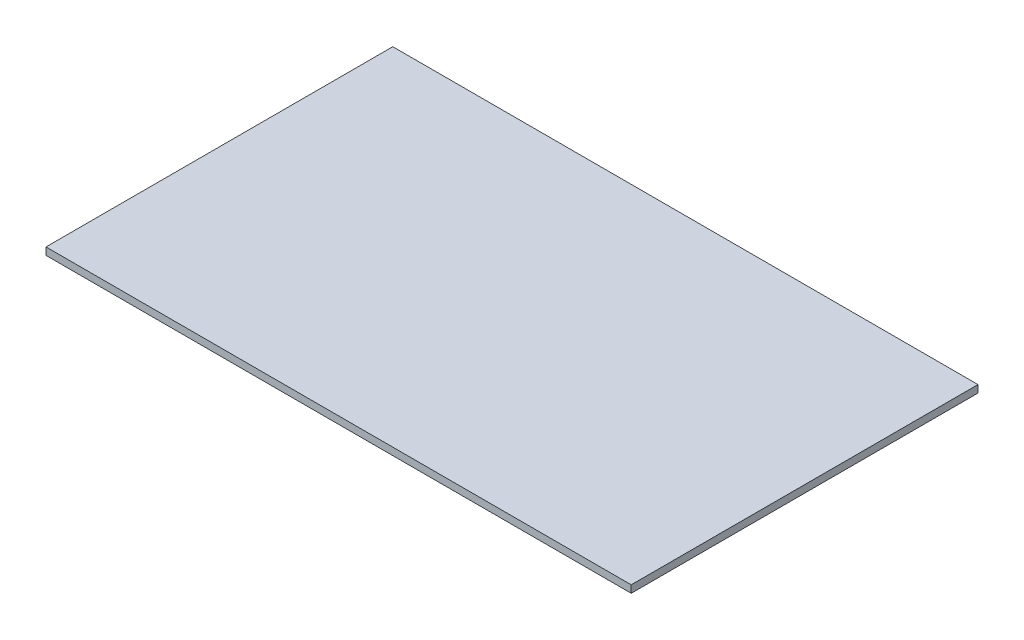
ISO-10303-21;
HEADER;
FILE_DESCRIPTION(('STEP AP214'),'2;1');
FILE_NAME('part.step','',(''),(''),'','','');
FILE_SCHEMA(('AUTOMOTIVE_DESIGN { 1 0 10303 214 1 1 1 1 }'));
ENDSEC;
DATA;
#1=APPLICATION_CONTEXT('core data for automotive mechanical design processes');
#2=APPLICATION_PROTOCOL_DEFINITION('international standard','automotive_design',2000,#1);
#3=PRODUCT_CONTEXT('',#1,'mechanical');
#4=PRODUCT('Part','Part','',(#3));
#5=PRODUCT_RELATED_PRODUCT_CATEGORY('part','',(#4));
#6=PRODUCT_DEFINITION_FORMATION('','',#4);
#7=PRODUCT_DEFINITION_CONTEXT('part definition',#1,'design');
#8=PRODUCT_DEFINITION('design','',#6,#7);
#9=PRODUCT_DEFINITION_SHAPE('','',#8);
#10=(LENGTH_UNIT() NAMED_UNIT(*) SI_UNIT(.MILLI.,.METRE.));
#11=(NAMED_UNIT(*) PLANE_ANGLE_UNIT() SI_UNIT($,.RADIAN.));
#12=(NAMED_UNIT(*) SI_UNIT($,.STERADIAN.) SOLID_ANGLE_UNIT());
#13=UNCERTAINTY_MEASURE_WITH_UNIT(LENGTH_MEASURE(1.E-05),#10,'distance_accuracy_value','');
#14=(GEOMETRIC_REPRESENTATION_CONTEXT(3) GLOBAL_UNCERTAINTY_ASSIGNED_CONTEXT((#13)) GLOBAL_UNIT_ASSIGNED_CONTEXT((#10,
#11,#12)) REPRESENTATION_CONTEXT('',''));
#15=CARTESIAN_POINT('',(0.,0.,0.));
#16=DIRECTION('',(0.,0.,1.));
#17=DIRECTION('',(1.,0.,0.));
#18=AXIS2_PLACEMENT_3D('',#15,#16,#17);
#19=CARTESIAN_POINT('',(-67.5,1.7,40.));
#20=DIRECTION('',(1.,0.,0.));
#21=DIRECTION('',(0.,0.,-1.));
#22=AXIS2_PLACEMENT_3D('',#19,#20,#21);
#23=PLANE('',#22);
#24=DIRECTION('',(0.,0.,1.));
#25=VECTOR('',#24,1.);
#26=CARTESIAN_POINT('',(-67.5,0.,40.));
#27=LINE('',#26,#25);
#28=CARTESIAN_POINT('',(-67.5,0.,-40.));
#29=VERTEX_POINT('',#28);
#30=CARTESIAN_POINT('',(-67.5,0.,40.));
#31=VERTEX_POINT('',#30);
#32=EDGE_CURVE('E107',#29,#31,#27,.T.);
#33=ORIENTED_EDGE('',*,*,#32,.T.);
#34=DIRECTION('',(0.,-1.,0.));
#35=VECTOR('',#34,1.);
#36=CARTESIAN_POINT('',(-67.5,1.7,40.));
#37=LINE('',#36,#35);
#38=CARTESIAN_POINT('',(-67.5,1.7,40.));
#39=VERTEX_POINT('',#38);
#40=EDGE_CURVE('E11',#39,#31,#37,.T.);
#41=ORIENTED_EDGE('',*,*,#40,.F.);
#42=DIRECTION('',(0.,0.,1.));
#43=VECTOR('',#42,1.);
#44=CARTESIAN_POINT('',(-67.5,1.7,40.));
#45=LINE('',#44,#43);
#46=CARTESIAN_POINT('',(-67.5,1.7,-40.));
#47=VERTEX_POINT('',#46);
#48=EDGE_CURVE('E91',#47,#39,#45,.T.);
#49=ORIENTED_EDGE('',*,*,#48,.F.);
#50=DIRECTION('',(0.,-1.,0.));
#51=VECTOR('',#50,1.);
#52=CARTESIAN_POINT('',(-67.5,1.7,-40.));
#53=LINE('',#52,#51);
#54=EDGE_CURVE('E103',#47,#29,#53,.T.);
#55=ORIENTED_EDGE('',*,*,#54,.T.);
#56=EDGE_LOOP('',(#33,#41,#49,#55));
#57=FACE_BOUND('',#56,.T.);
#58=ADVANCED_FACE('F39',(#57),#23,.F.);
#59=CARTESIAN_POINT('',(67.5,1.7,40.));
#60=DIRECTION('',(0.,0.,-1.));
#61=DIRECTION('',(-1.,0.,0.));
#62=AXIS2_PLACEMENT_3D('',#59,#60,#61);
#63=PLANE('',#62);
#64=DIRECTION('',(1.,0.,0.));
#65=VECTOR('',#64,1.);
#66=CARTESIAN_POINT('',(67.5,0.,40.));
#67=LINE('',#66,#65);
#68=CARTESIAN_POINT('',(67.5,0.,40.));
#69=VERTEX_POINT('',#68);
#70=EDGE_CURVE('E96',#31,#69,#67,.T.);
#71=ORIENTED_EDGE('',*,*,#70,.T.);
#72=DIRECTION('',(0.,-1.,0.));
#73=VECTOR('',#72,1.);
#74=CARTESIAN_POINT('',(67.5,1.7,40.));
#75=LINE('',#74,#73);
#76=CARTESIAN_POINT('',(67.5,1.7,40.));
#77=VERTEX_POINT('',#76);
#78=EDGE_CURVE('E48',#77,#69,#75,.T.);
#79=ORIENTED_EDGE('',*,*,#78,.F.);
#80=DIRECTION('',(1.,0.,0.));
#81=VECTOR('',#80,1.);
#82=CARTESIAN_POINT('',(67.5,1.7,40.));
#83=LINE('',#82,#81);
#84=EDGE_CURVE('E86',#39,#77,#83,.T.);
#85=ORIENTED_EDGE('',*,*,#84,.F.);
#86=ORIENTED_EDGE('',*,*,#40,.T.);
#87=EDGE_LOOP('',(#71,#79,#85,#86));
#88=FACE_BOUND('',#87,.T.);
#89=ADVANCED_FACE('F95',(#88),#63,.F.);
#90=CARTESIAN_POINT('',(67.5,1.7,40.));
#91=DIRECTION('',(-1.,0.,0.));
#92=DIRECTION('',(0.,0.,1.));
#93=AXIS2_PLACEMENT_3D('',#90,#91,#92);
#94=PLANE('',#93);
#95=DIRECTION('',(0.,0.,-1.));
#96=VECTOR('',#95,1.);
#97=CARTESIAN_POINT('',(67.5,0.,40.));
#98=LINE('',#97,#96);
#99=CARTESIAN_POINT('',(67.5,0.,-40.));
#100=VERTEX_POINT('',#99);
#101=EDGE_CURVE('E73',#69,#100,#98,.T.);
#102=ORIENTED_EDGE('',*,*,#101,.T.);
#103=DIRECTION('',(0.,-1.,0.));
#104=VECTOR('',#103,1.);
#105=CARTESIAN_POINT('',(67.5,1.7,-40.));
#106=LINE('',#105,#104);
#107=CARTESIAN_POINT('',(67.5,1.7,-40.));
#108=VERTEX_POINT('',#107);
#109=EDGE_CURVE('E98',#108,#100,#106,.T.);
#110=ORIENTED_EDGE('',*,*,#109,.F.);
#111=DIRECTION('',(0.,0.,-1.));
#112=VECTOR('',#111,1.);
#113=CARTESIAN_POINT('',(67.5,1.7,40.));
#114=LINE('',#113,#112);
#115=EDGE_CURVE('E89',#77,#108,#114,.T.);
#116=ORIENTED_EDGE('',*,*,#115,.F.);
#117=ORIENTED_EDGE('',*,*,#78,.T.);
#118=EDGE_LOOP('',(#102,#110,#116,#117));
#119=FACE_BOUND('',#118,.T.);
#120=ADVANCED_FACE('F99',(#119),#94,.F.);
#121=CARTESIAN_POINT('',(67.5,1.7,-40.));
#122=DIRECTION('',(0.,0.,1.));
#123=DIRECTION('',(1.,0.,0.));
#124=AXIS2_PLACEMENT_3D('',#121,#122,#123);
#125=PLANE('',#124);
#126=DIRECTION('',(-1.,0.,0.));
#127=VECTOR('',#126,1.);
#128=CARTESIAN_POINT('',(67.5,0.,-40.));
#129=LINE('',#128,#127);
#130=EDGE_CURVE('E79',#100,#29,#129,.T.);
#131=ORIENTED_EDGE('',*,*,#130,.T.);
#132=ORIENTED_EDGE('',*,*,#54,.F.);
#133=DIRECTION('',(-1.,0.,0.));
#134=VECTOR('',#133,1.);
#135=CARTESIAN_POINT('',(67.5,1.7,-40.));
#136=LINE('',#135,#134);
#137=EDGE_CURVE('E56',#108,#47,#136,.T.);
#138=ORIENTED_EDGE('',*,*,#137,.F.);
#139=ORIENTED_EDGE('',*,*,#109,.T.);
#140=EDGE_LOOP('',(#131,#132,#138,#139));
#141=FACE_BOUND('',#140,.T.);
#142=ADVANCED_FACE('F120',(#141),#125,.F.);
#143=CARTESIAN_POINT('',(0.,1.7,0.));
#144=DIRECTION('',(0.,1.,0.));
#145=DIRECTION('',(0.,0.,1.));
#146=AXIS2_PLACEMENT_3D('',#143,#144,#145);
#147=PLANE('',#146);
#148=ORIENTED_EDGE('',*,*,#48,.T.);
#149=ORIENTED_EDGE('',*,*,#84,.T.);
#150=ORIENTED_EDGE('',*,*,#115,.T.);
#151=ORIENTED_EDGE('',*,*,#137,.T.);
#152=EDGE_LOOP('',(#148,#149,#150,#151));
#153=FACE_BOUND('',#152,.T.);
#154=ADVANCED_FACE('F87',(#153),#147,.T.);
#155=CARTESIAN_POINT('',(0.,0.,0.));
#156=DIRECTION('',(0.,1.,0.));
#157=DIRECTION('',(0.,0.,1.));
#158=AXIS2_PLACEMENT_3D('',#155,#156,#157);
#159=PLANE('',#158);
#160=ORIENTED_EDGE('',*,*,#32,.F.);
#161=ORIENTED_EDGE('',*,*,#130,.F.);
#162=ORIENTED_EDGE('',*,*,#101,.F.);
#163=ORIENTED_EDGE('',*,*,#70,.F.);
#164=EDGE_LOOP('',(#160,#161,#162,#163));
#165=FACE_BOUND('',#164,.T.);
#166=ADVANCED_FACE('F123',(#165),#159,.F.);
#167=CLOSED_SHELL('',(#58,#89,#120,#142,#154,#166));
#168=MANIFOLD_SOLID_BREP('B2',#167);
#169=ADVANCED_BREP_SHAPE_REPRESENTATION('',(#18,#168),#14);
#170=SHAPE_DEFINITION_REPRESENTATION(#9,#169);
ENDSEC;
END-ISO-10303-21;
